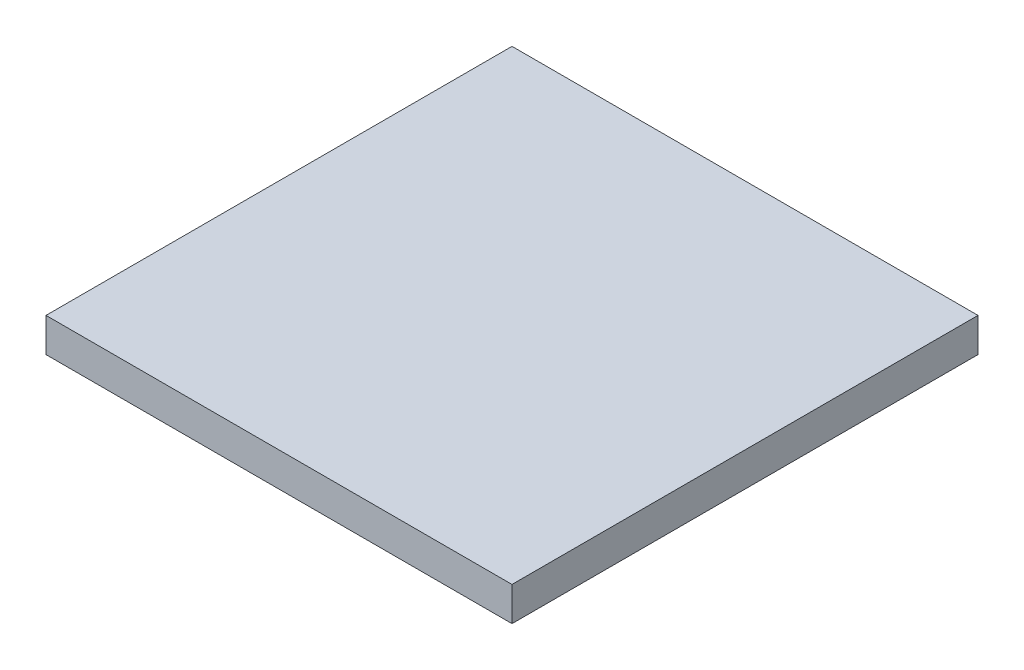
ISO-10303-21;
HEADER;
FILE_DESCRIPTION(('STEP AP214'),'2;1');
FILE_NAME('part.step','',(''),(''),'','','');
FILE_SCHEMA(('AUTOMOTIVE_DESIGN { 1 0 10303 214 1 1 1 1 }'));
ENDSEC;
DATA;
#1=APPLICATION_CONTEXT('core data for automotive mechanical design processes');
#2=APPLICATION_PROTOCOL_DEFINITION('international standard','automotive_design',2000,#1);
#3=PRODUCT_CONTEXT('',#1,'mechanical');
#4=PRODUCT('Part','Part','',(#3));
#5=PRODUCT_RELATED_PRODUCT_CATEGORY('part','',(#4));
#6=PRODUCT_DEFINITION_FORMATION('','',#4);
#7=PRODUCT_DEFINITION_CONTEXT('part definition',#1,'design');
#8=PRODUCT_DEFINITION('design','',#6,#7);
#9=PRODUCT_DEFINITION_SHAPE('','',#8);
#10=(LENGTH_UNIT() NAMED_UNIT(*) SI_UNIT(.MILLI.,.METRE.));
#11=(NAMED_UNIT(*) PLANE_ANGLE_UNIT() SI_UNIT($,.RADIAN.));
#12=(NAMED_UNIT(*) SI_UNIT($,.STERADIAN.) SOLID_ANGLE_UNIT());
#13=UNCERTAINTY_MEASURE_WITH_UNIT(LENGTH_MEASURE(1.E-05),#10,'distance_accuracy_value','');
#14=(GEOMETRIC_REPRESENTATION_CONTEXT(3) GLOBAL_UNCERTAINTY_ASSIGNED_CONTEXT((#13)) GLOBAL_UNIT_ASSIGNED_CONTEXT((#10,
#11,#12)) REPRESENTATION_CONTEXT('',''));
#15=CARTESIAN_POINT('',(0.,0.,0.));
#16=DIRECTION('',(0.,0.,1.));
#17=DIRECTION('',(1.,0.,0.));
#18=AXIS2_PLACEMENT_3D('',#15,#16,#17);
#19=CARTESIAN_POINT('',(-171.45,-25.,171.45));
#20=DIRECTION('',(-1.,0.,0.));
#21=DIRECTION('',(0.,0.,1.));
#22=AXIS2_PLACEMENT_3D('',#19,#20,#21);
#23=PLANE('',#22);
#24=DIRECTION('',(0.,0.,1.));
#25=VECTOR('',#24,1.);
#26=CARTESIAN_POINT('',(-171.45,0.,171.45));
#27=LINE('',#26,#25);
#28=CARTESIAN_POINT('',(-171.45,0.,-171.45));
#29=VERTEX_POINT('',#28);
#30=CARTESIAN_POINT('',(-171.45,0.,171.45));
#31=VERTEX_POINT('',#30);
#32=EDGE_CURVE('E97',#29,#31,#27,.T.);
#33=ORIENTED_EDGE('',*,*,#32,.F.);
#34=DIRECTION('',(0.,1.,0.));
#35=VECTOR('',#34,1.);
#36=CARTESIAN_POINT('',(-171.45,-25.,-171.45));
#37=LINE('',#36,#35);
#38=CARTESIAN_POINT('',(-171.45,-25.,-171.45));
#39=VERTEX_POINT('',#38);
#40=EDGE_CURVE('E11',#39,#29,#37,.T.);
#41=ORIENTED_EDGE('',*,*,#40,.F.);
#42=DIRECTION('',(0.,0.,1.));
#43=VECTOR('',#42,1.);
#44=CARTESIAN_POINT('',(-171.45,-25.,171.45));
#45=LINE('',#44,#43);
#46=CARTESIAN_POINT('',(-171.45,-25.,171.45));
#47=VERTEX_POINT('',#46);
#48=EDGE_CURVE('E91',#39,#47,#45,.T.);
#49=ORIENTED_EDGE('',*,*,#48,.T.);
#50=DIRECTION('',(0.,1.,0.));
#51=VECTOR('',#50,1.);
#52=CARTESIAN_POINT('',(-171.45,-25.,171.45));
#53=LINE('',#52,#51);
#54=EDGE_CURVE('E36',#47,#31,#53,.T.);
#55=ORIENTED_EDGE('',*,*,#54,.T.);
#56=EDGE_LOOP('',(#33,#41,#49,#55));
#57=FACE_BOUND('',#56,.T.);
#58=ADVANCED_FACE('F33',(#57),#23,.T.);
#59=CARTESIAN_POINT('',(171.45,-25.,-171.45));
#60=DIRECTION('',(0.,0.,-1.));
#61=DIRECTION('',(-1.,0.,0.));
#62=AXIS2_PLACEMENT_3D('',#59,#60,#61);
#63=PLANE('',#62);
#64=DIRECTION('',(-1.,0.,0.));
#65=VECTOR('',#64,1.);
#66=CARTESIAN_POINT('',(171.45,0.,-171.45));
#67=LINE('',#66,#65);
#68=CARTESIAN_POINT('',(171.45,0.,-171.45));
#69=VERTEX_POINT('',#68);
#70=EDGE_CURVE('E93',#69,#29,#67,.T.);
#71=ORIENTED_EDGE('',*,*,#70,.F.);
#72=DIRECTION('',(0.,1.,0.));
#73=VECTOR('',#72,1.);
#74=CARTESIAN_POINT('',(171.45,-25.,-171.45));
#75=LINE('',#74,#73);
#76=CARTESIAN_POINT('',(171.45,-25.,-171.45));
#77=VERTEX_POINT('',#76);
#78=EDGE_CURVE('E42',#77,#69,#75,.T.);
#79=ORIENTED_EDGE('',*,*,#78,.F.);
#80=DIRECTION('',(-1.,0.,0.));
#81=VECTOR('',#80,1.);
#82=CARTESIAN_POINT('',(171.45,-25.,-171.45));
#83=LINE('',#82,#81);
#84=EDGE_CURVE('E88',#77,#39,#83,.T.);
#85=ORIENTED_EDGE('',*,*,#84,.T.);
#86=ORIENTED_EDGE('',*,*,#40,.T.);
#87=EDGE_LOOP('',(#71,#79,#85,#86));
#88=FACE_BOUND('',#87,.T.);
#89=ADVANCED_FACE('F107',(#88),#63,.T.);
#90=CARTESIAN_POINT('',(171.45,-25.,171.45));
#91=DIRECTION('',(1.,0.,0.));
#92=DIRECTION('',(0.,0.,-1.));
#93=AXIS2_PLACEMENT_3D('',#90,#91,#92);
#94=PLANE('',#93);
#95=DIRECTION('',(0.,0.,-1.));
#96=VECTOR('',#95,1.);
#97=CARTESIAN_POINT('',(171.45,0.,171.45));
#98=LINE('',#97,#96);
#99=CARTESIAN_POINT('',(171.45,0.,171.45));
#100=VERTEX_POINT('',#99);
#101=EDGE_CURVE('E83',#100,#69,#98,.T.);
#102=ORIENTED_EDGE('',*,*,#101,.F.);
#103=DIRECTION('',(0.,1.,0.));
#104=VECTOR('',#103,1.);
#105=CARTESIAN_POINT('',(171.45,-25.,171.45));
#106=LINE('',#105,#104);
#107=CARTESIAN_POINT('',(171.45,-25.,171.45));
#108=VERTEX_POINT('',#107);
#109=EDGE_CURVE('E78',#108,#100,#106,.T.);
#110=ORIENTED_EDGE('',*,*,#109,.F.);
#111=DIRECTION('',(0.,0.,-1.));
#112=VECTOR('',#111,1.);
#113=CARTESIAN_POINT('',(171.45,-25.,171.45));
#114=LINE('',#113,#112);
#115=EDGE_CURVE('E81',#108,#77,#114,.T.);
#116=ORIENTED_EDGE('',*,*,#115,.T.);
#117=ORIENTED_EDGE('',*,*,#78,.T.);
#118=EDGE_LOOP('',(#102,#110,#116,#117));
#119=FACE_BOUND('',#118,.T.);
#120=ADVANCED_FACE('F80',(#119),#94,.T.);
#121=CARTESIAN_POINT('',(171.45,-25.,171.45));
#122=DIRECTION('',(0.,0.,1.));
#123=DIRECTION('',(1.,0.,0.));
#124=AXIS2_PLACEMENT_3D('',#121,#122,#123);
#125=PLANE('',#124);
#126=DIRECTION('',(1.,0.,0.));
#127=VECTOR('',#126,1.);
#128=CARTESIAN_POINT('',(171.45,0.,171.45));
#129=LINE('',#128,#127);
#130=EDGE_CURVE('E100',#31,#100,#129,.T.);
#131=ORIENTED_EDGE('',*,*,#130,.F.);
#132=ORIENTED_EDGE('',*,*,#54,.F.);
#133=DIRECTION('',(1.,0.,0.));
#134=VECTOR('',#133,1.);
#135=CARTESIAN_POINT('',(171.45,-25.,171.45));
#136=LINE('',#135,#134);
#137=EDGE_CURVE('E87',#47,#108,#136,.T.);
#138=ORIENTED_EDGE('',*,*,#137,.T.);
#139=ORIENTED_EDGE('',*,*,#109,.T.);
#140=EDGE_LOOP('',(#131,#132,#138,#139));
#141=FACE_BOUND('',#140,.T.);
#142=ADVANCED_FACE('F90',(#141),#125,.T.);
#143=CARTESIAN_POINT('',(0.,-25.,0.));
#144=DIRECTION('',(0.,1.,0.));
#145=DIRECTION('',(0.,0.,1.));
#146=AXIS2_PLACEMENT_3D('',#143,#144,#145);
#147=PLANE('',#146);
#148=ORIENTED_EDGE('',*,*,#48,.F.);
#149=ORIENTED_EDGE('',*,*,#84,.F.);
#150=ORIENTED_EDGE('',*,*,#115,.F.);
#151=ORIENTED_EDGE('',*,*,#137,.F.);
#152=EDGE_LOOP('',(#148,#149,#150,#151));
#153=FACE_BOUND('',#152,.T.);
#154=ADVANCED_FACE('F86',(#153),#147,.F.);
#155=CARTESIAN_POINT('',(0.,0.,0.));
#156=DIRECTION('',(0.,1.,0.));
#157=DIRECTION('',(0.,0.,1.));
#158=AXIS2_PLACEMENT_3D('',#155,#156,#157);
#159=PLANE('',#158);
#160=ORIENTED_EDGE('',*,*,#32,.T.);
#161=ORIENTED_EDGE('',*,*,#130,.T.);
#162=ORIENTED_EDGE('',*,*,#101,.T.);
#163=ORIENTED_EDGE('',*,*,#70,.T.);
#164=EDGE_LOOP('',(#160,#161,#162,#163));
#165=FACE_BOUND('',#164,.T.);
#166=ADVANCED_FACE('F106',(#165),#159,.T.);
#167=CLOSED_SHELL('',(#58,#89,#120,#142,#154,#166));
#168=MANIFOLD_SOLID_BREP('B2',#167);
#169=ADVANCED_BREP_SHAPE_REPRESENTATION('',(#18,#168),#14);
#170=SHAPE_DEFINITION_REPRESENTATION(#9,#169);
ENDSEC;
END-ISO-10303-21;
